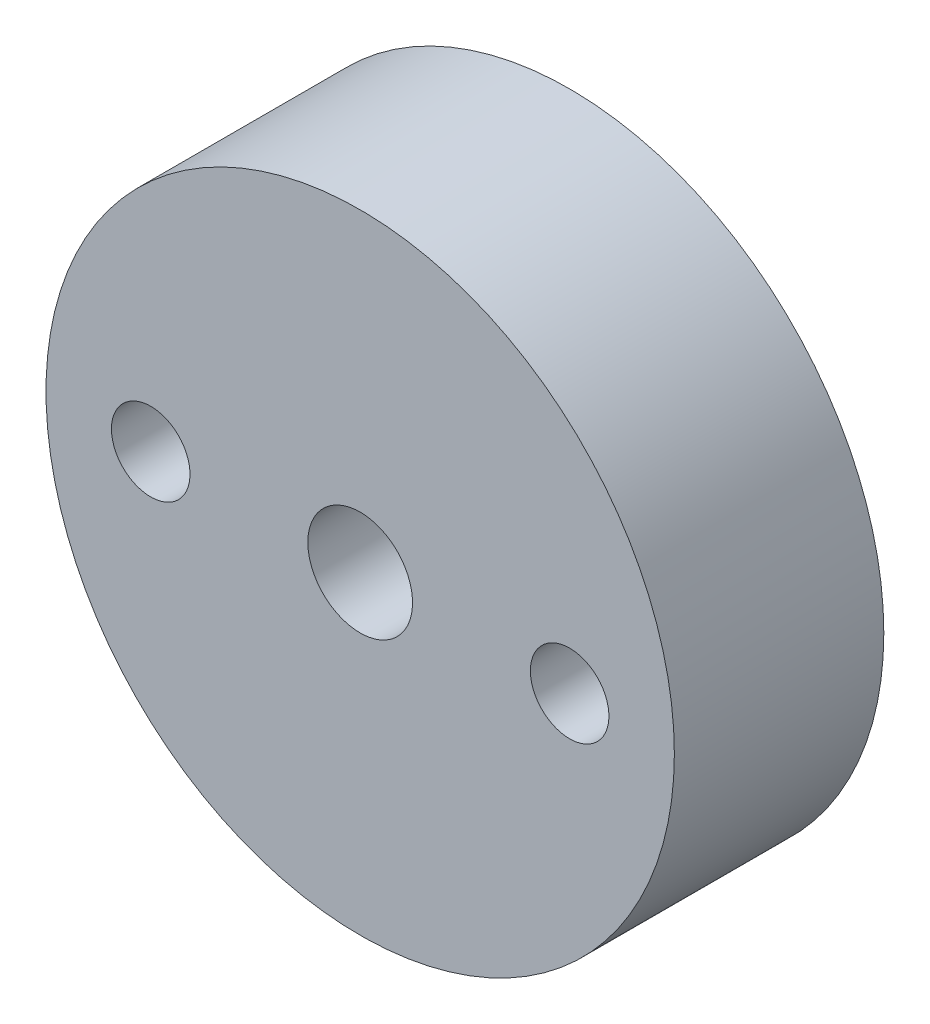
ISO-10303-21;
HEADER;
FILE_DESCRIPTION(('STEP AP214'),'2;1');
FILE_NAME('part.step','',(''),(''),'','','');
FILE_SCHEMA(('AUTOMOTIVE_DESIGN { 1 0 10303 214 1 1 1 1 }'));
ENDSEC;
DATA;
#1=APPLICATION_CONTEXT('core data for automotive mechanical design processes');
#2=APPLICATION_PROTOCOL_DEFINITION('international standard','automotive_design',2000,#1);
#3=PRODUCT_CONTEXT('',#1,'mechanical');
#4=PRODUCT('Part','Part','',(#3));
#5=PRODUCT_RELATED_PRODUCT_CATEGORY('part','',(#4));
#6=PRODUCT_DEFINITION_FORMATION('','',#4);
#7=PRODUCT_DEFINITION_CONTEXT('part definition',#1,'design');
#8=PRODUCT_DEFINITION('design','',#6,#7);
#9=PRODUCT_DEFINITION_SHAPE('','',#8);
#10=(LENGTH_UNIT() NAMED_UNIT(*) SI_UNIT(.MILLI.,.METRE.));
#11=(NAMED_UNIT(*) PLANE_ANGLE_UNIT() SI_UNIT($,.RADIAN.));
#12=(NAMED_UNIT(*) SI_UNIT($,.STERADIAN.) SOLID_ANGLE_UNIT());
#13=UNCERTAINTY_MEASURE_WITH_UNIT(LENGTH_MEASURE(1.E-05),#10,'distance_accuracy_value','');
#14=(GEOMETRIC_REPRESENTATION_CONTEXT(3) GLOBAL_UNCERTAINTY_ASSIGNED_CONTEXT((#13)) GLOBAL_UNIT_ASSIGNED_CONTEXT((#10,
#11,#12)) REPRESENTATION_CONTEXT('',''));
#15=CARTESIAN_POINT('',(0.,0.,0.));
#16=DIRECTION('',(0.,0.,1.));
#17=DIRECTION('',(1.,0.,0.));
#18=AXIS2_PLACEMENT_3D('',#15,#16,#17);
#19=CARTESIAN_POINT('',(0.,0.,25.4));
#20=DIRECTION('',(0.,0.,-1.));
#21=DIRECTION('',(-1.,0.,0.));
#22=AXIS2_PLACEMENT_3D('',#19,#20,#21);
#23=CYLINDRICAL_SURFACE('',#22,38.1);
#24=CARTESIAN_POINT('',(0.,0.,25.4));
#25=DIRECTION('',(0.,0.,1.));
#26=DIRECTION('',(1.,0.,0.));
#27=AXIS2_PLACEMENT_3D('',#24,#25,#26);
#28=CIRCLE('',#27,38.1);
#29=CARTESIAN_POINT('',(38.1,0.,25.4));
#30=VERTEX_POINT('',#29);
#31=EDGE_CURVE('E10',#30,#30,#28,.T.);
#32=ORIENTED_EDGE('',*,*,#31,.F.);
#33=EDGE_LOOP('',(#32));
#34=FACE_BOUND('',#33,.T.);
#35=CARTESIAN_POINT('',(0.,0.,0.));
#36=DIRECTION('',(0.,0.,1.));
#37=DIRECTION('',(1.,0.,0.));
#38=AXIS2_PLACEMENT_3D('',#35,#36,#37);
#39=CIRCLE('',#38,38.1);
#40=CARTESIAN_POINT('',(38.1,0.,0.));
#41=VERTEX_POINT('',#40);
#42=EDGE_CURVE('E33',#41,#41,#39,.T.);
#43=ORIENTED_EDGE('',*,*,#42,.T.);
#44=EDGE_LOOP('',(#43));
#45=FACE_BOUND('',#44,.T.);
#46=ADVANCED_FACE('F30',(#34,#45),#23,.T.);
#47=CARTESIAN_POINT('',(0.,0.,25.4));
#48=DIRECTION('',(0.,0.,1.));
#49=DIRECTION('',(1.,0.,0.));
#50=AXIS2_PLACEMENT_3D('',#47,#48,#49);
#51=PLANE('',#50);
#52=CARTESIAN_POINT('',(0.,0.,25.4));
#53=DIRECTION('',(0.,0.,-1.));
#54=DIRECTION('',(-1.,0.,0.));
#55=AXIS2_PLACEMENT_3D('',#52,#53,#54);
#56=CIRCLE('',#55,6.35);
#57=CARTESIAN_POINT('',(-6.35,0.,25.4));
#58=VERTEX_POINT('',#57);
#59=EDGE_CURVE('E51',#58,#58,#56,.T.);
#60=ORIENTED_EDGE('',*,*,#59,.T.);
#61=EDGE_LOOP('',(#60));
#62=FACE_BOUND('',#61,.T.);
#63=CARTESIAN_POINT('',(-25.4,0.,25.4));
#64=DIRECTION('',(0.,0.,-1.));
#65=DIRECTION('',(-1.,0.,0.));
#66=AXIS2_PLACEMENT_3D('',#63,#64,#65);
#67=CIRCLE('',#66,4.7625);
#68=CARTESIAN_POINT('',(-30.1625,0.,25.4));
#69=VERTEX_POINT('',#68);
#70=EDGE_CURVE('E45',#69,#69,#67,.T.);
#71=ORIENTED_EDGE('',*,*,#70,.T.);
#72=EDGE_LOOP('',(#71));
#73=FACE_BOUND('',#72,.T.);
#74=CARTESIAN_POINT('',(25.4,0.,25.4));
#75=DIRECTION('',(0.,0.,-1.));
#76=DIRECTION('',(-1.,0.,0.));
#77=AXIS2_PLACEMENT_3D('',#74,#75,#76);
#78=CIRCLE('',#77,4.7625);
#79=CARTESIAN_POINT('',(20.6375,0.,25.4));
#80=VERTEX_POINT('',#79);
#81=EDGE_CURVE('E40',#80,#80,#78,.T.);
#82=ORIENTED_EDGE('',*,*,#81,.T.);
#83=EDGE_LOOP('',(#82));
#84=FACE_BOUND('',#83,.T.);
#85=ORIENTED_EDGE('',*,*,#31,.T.);
#86=EDGE_LOOP('',(#85));
#87=FACE_BOUND('',#86,.T.);
#88=ADVANCED_FACE('F60',(#62,#73,#84,#87),#51,.T.);
#89=CARTESIAN_POINT('',(0.,0.,0.));
#90=DIRECTION('',(0.,0.,1.));
#91=DIRECTION('',(1.,0.,0.));
#92=AXIS2_PLACEMENT_3D('',#89,#90,#91);
#93=PLANE('',#92);
#94=CARTESIAN_POINT('',(0.,0.,0.));
#95=DIRECTION('',(0.,0.,-1.));
#96=DIRECTION('',(-1.,0.,0.));
#97=AXIS2_PLACEMENT_3D('',#94,#95,#96);
#98=CIRCLE('',#97,6.35);
#99=CARTESIAN_POINT('',(-6.35,0.,0.));
#100=VERTEX_POINT('',#99);
#101=EDGE_CURVE('E54',#100,#100,#98,.T.);
#102=ORIENTED_EDGE('',*,*,#101,.F.);
#103=EDGE_LOOP('',(#102));
#104=FACE_BOUND('',#103,.T.);
#105=CARTESIAN_POINT('',(-25.4,0.,0.));
#106=DIRECTION('',(0.,0.,-1.));
#107=DIRECTION('',(-1.,0.,0.));
#108=AXIS2_PLACEMENT_3D('',#105,#106,#107);
#109=CIRCLE('',#108,4.7625);
#110=CARTESIAN_POINT('',(-30.1625,0.,0.));
#111=VERTEX_POINT('',#110);
#112=EDGE_CURVE('E48',#111,#111,#109,.T.);
#113=ORIENTED_EDGE('',*,*,#112,.F.);
#114=EDGE_LOOP('',(#113));
#115=FACE_BOUND('',#114,.T.);
#116=CARTESIAN_POINT('',(25.4,0.,0.));
#117=DIRECTION('',(0.,0.,-1.));
#118=DIRECTION('',(-1.,0.,0.));
#119=AXIS2_PLACEMENT_3D('',#116,#117,#118);
#120=CIRCLE('',#119,4.7625);
#121=CARTESIAN_POINT('',(20.6375,0.,0.));
#122=VERTEX_POINT('',#121);
#123=EDGE_CURVE('E42',#122,#122,#120,.T.);
#124=ORIENTED_EDGE('',*,*,#123,.F.);
#125=EDGE_LOOP('',(#124));
#126=FACE_BOUND('',#125,.T.);
#127=ORIENTED_EDGE('',*,*,#42,.F.);
#128=EDGE_LOOP('',(#127));
#129=FACE_BOUND('',#128,.T.);
#130=ADVANCED_FACE('F70',(#104,#115,#126,#129),#93,.F.);
#131=CARTESIAN_POINT('',(25.4,0.,25.4));
#132=DIRECTION('',(0.,0.,-1.));
#133=DIRECTION('',(-1.,0.,0.));
#134=AXIS2_PLACEMENT_3D('',#131,#132,#133);
#135=CYLINDRICAL_SURFACE('',#134,4.7625);
#136=ORIENTED_EDGE('',*,*,#81,.F.);
#137=EDGE_LOOP('',(#136));
#138=FACE_BOUND('',#137,.T.);
#139=ORIENTED_EDGE('',*,*,#123,.T.);
#140=EDGE_LOOP('',(#139));
#141=FACE_BOUND('',#140,.T.);
#142=ADVANCED_FACE('F73',(#138,#141),#135,.F.);
#143=CARTESIAN_POINT('',(-25.4,0.,25.4));
#144=DIRECTION('',(0.,0.,-1.));
#145=DIRECTION('',(-1.,0.,0.));
#146=AXIS2_PLACEMENT_3D('',#143,#144,#145);
#147=CYLINDRICAL_SURFACE('',#146,4.7625);
#148=ORIENTED_EDGE('',*,*,#70,.F.);
#149=EDGE_LOOP('',(#148));
#150=FACE_BOUND('',#149,.T.);
#151=ORIENTED_EDGE('',*,*,#112,.T.);
#152=EDGE_LOOP('',(#151));
#153=FACE_BOUND('',#152,.T.);
#154=ADVANCED_FACE('F66',(#150,#153),#147,.F.);
#155=CARTESIAN_POINT('',(0.,0.,25.4));
#156=DIRECTION('',(0.,0.,-1.));
#157=DIRECTION('',(-1.,0.,0.));
#158=AXIS2_PLACEMENT_3D('',#155,#156,#157);
#159=CYLINDRICAL_SURFACE('',#158,6.35);
#160=ORIENTED_EDGE('',*,*,#59,.F.);
#161=EDGE_LOOP('',(#160));
#162=FACE_BOUND('',#161,.T.);
#163=ORIENTED_EDGE('',*,*,#101,.T.);
#164=EDGE_LOOP('',(#163));
#165=FACE_BOUND('',#164,.T.);
#166=ADVANCED_FACE('F63',(#162,#165),#159,.F.);
#167=CLOSED_SHELL('',(#46,#88,#130,#142,#154,#166));
#168=MANIFOLD_SOLID_BREP('B2',#167);
#169=ADVANCED_BREP_SHAPE_REPRESENTATION('',(#18,#168),#14);
#170=SHAPE_DEFINITION_REPRESENTATION(#9,#169);
ENDSEC;
END-ISO-10303-21;
